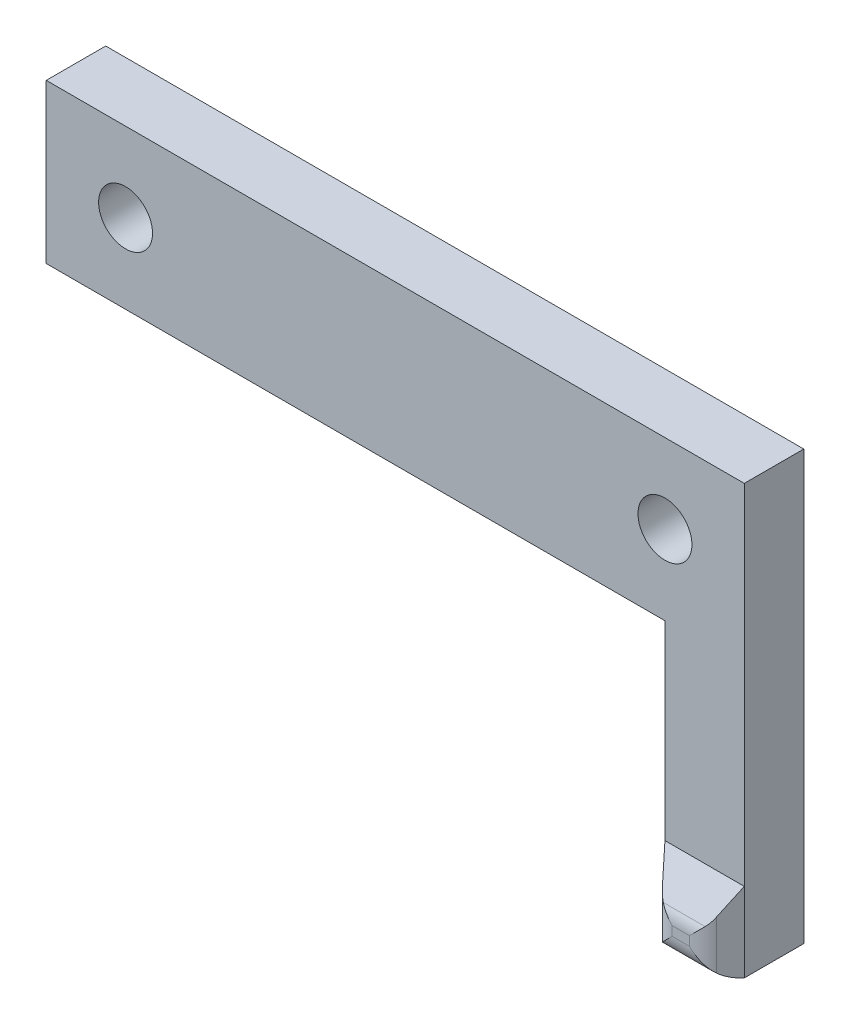
ISO-10303-21;
HEADER;
FILE_DESCRIPTION(('STEP AP214'),'2;1');
FILE_NAME('part.step','',(''),(''),'','','');
FILE_SCHEMA(('AUTOMOTIVE_DESIGN { 1 0 10303 214 1 1 1 1 }'));
ENDSEC;
DATA;
#1=APPLICATION_CONTEXT('core data for automotive mechanical design processes');
#2=APPLICATION_PROTOCOL_DEFINITION('international standard','automotive_design',2000,#1);
#3=PRODUCT_CONTEXT('',#1,'mechanical');
#4=PRODUCT('Part','Part','',(#3));
#5=PRODUCT_RELATED_PRODUCT_CATEGORY('part','',(#4));
#6=PRODUCT_DEFINITION_FORMATION('','',#4);
#7=PRODUCT_DEFINITION_CONTEXT('part definition',#1,'design');
#8=PRODUCT_DEFINITION('design','',#6,#7);
#9=PRODUCT_DEFINITION_SHAPE('','',#8);
#10=(LENGTH_UNIT() NAMED_UNIT(*) SI_UNIT(.MILLI.,.METRE.));
#11=(NAMED_UNIT(*) PLANE_ANGLE_UNIT() SI_UNIT($,.RADIAN.));
#12=(NAMED_UNIT(*) SI_UNIT($,.STERADIAN.) SOLID_ANGLE_UNIT());
#13=UNCERTAINTY_MEASURE_WITH_UNIT(LENGTH_MEASURE(1.E-05),#10,'distance_accuracy_value','');
#14=(GEOMETRIC_REPRESENTATION_CONTEXT(3) GLOBAL_UNCERTAINTY_ASSIGNED_CONTEXT((#13)) GLOBAL_UNIT_ASSIGNED_CONTEXT((#10,
#11,#12)) REPRESENTATION_CONTEXT('',''));
#15=CARTESIAN_POINT('',(0.,0.,0.));
#16=DIRECTION('',(0.,0.,1.));
#17=DIRECTION('',(1.,0.,0.));
#18=AXIS2_PLACEMENT_3D('',#15,#16,#17);
#19=CARTESIAN_POINT('',(78.,-10.,7.5));
#20=DIRECTION('',(0.,1.,0.));
#21=DIRECTION('',(0.,0.,1.));
#22=AXIS2_PLACEMENT_3D('',#19,#20,#21);
#23=PLANE('',#22);
#24=DIRECTION('',(0.,0.,-1.));
#25=VECTOR('',#24,1.);
#26=CARTESIAN_POINT('',(68.,-10.,7.5));
#27=LINE('',#26,#25);
#28=CARTESIAN_POINT('',(68.,-10.,7.5));
#29=VERTEX_POINT('',#28);
#30=CARTESIAN_POINT('',(68.,-10.,0.));
#31=VERTEX_POINT('',#30);
#32=EDGE_CURVE('E273',#29,#31,#27,.T.);
#33=ORIENTED_EDGE('',*,*,#32,.F.);
#34=DIRECTION('',(1.,0.,0.));
#35=VECTOR('',#34,1.);
#36=CARTESIAN_POINT('',(78.,-10.,7.5));
#37=LINE('',#36,#35);
#38=CARTESIAN_POINT('',(-10.,-10.,7.5));
#39=VERTEX_POINT('',#38);
#40=EDGE_CURVE('E174',#39,#29,#37,.T.);
#41=ORIENTED_EDGE('',*,*,#40,.F.);
#42=DIRECTION('',(0.,0.,-1.));
#43=VECTOR('',#42,1.);
#44=CARTESIAN_POINT('',(-10.,-10.,7.5));
#45=LINE('',#44,#43);
#46=CARTESIAN_POINT('',(-10.,-10.,0.));
#47=VERTEX_POINT('',#46);
#48=EDGE_CURVE('E208',#39,#47,#45,.T.);
#49=ORIENTED_EDGE('',*,*,#48,.T.);
#50=DIRECTION('',(1.,0.,0.));
#51=VECTOR('',#50,1.);
#52=CARTESIAN_POINT('',(78.,-10.,0.));
#53=LINE('',#52,#51);
#54=EDGE_CURVE('E300',#47,#31,#53,.T.);
#55=ORIENTED_EDGE('',*,*,#54,.T.);
#56=EDGE_LOOP('',(#33,#41,#49,#55));
#57=FACE_BOUND('',#56,.T.);
#58=ADVANCED_FACE('F57',(#57),#23,.F.);
#59=CARTESIAN_POINT('',(0.,0.,7.5));
#60=DIRECTION('',(0.,0.,-1.));
#61=DIRECTION('',(-1.,0.,0.));
#62=AXIS2_PLACEMENT_3D('',#59,#60,#61);
#63=PLANE('',#62);
#64=DIRECTION('',(0.,1.,0.));
#65=VECTOR('',#64,1.);
#66=CARTESIAN_POINT('',(68.,-44.,7.5));
#67=LINE('',#66,#65);
#68=CARTESIAN_POINT('',(68.,-34.,7.5));
#69=VERTEX_POINT('',#68);
#70=EDGE_CURVE('E170',#69,#29,#67,.T.);
#71=ORIENTED_EDGE('',*,*,#70,.F.);
#72=DIRECTION('',(-1.,0.,0.));
#73=VECTOR('',#72,1.);
#74=CARTESIAN_POINT('',(78.,-34.,7.5));
#75=LINE('',#74,#73);
#76=CARTESIAN_POINT('',(78.,-34.,7.5));
#77=VERTEX_POINT('',#76);
#78=EDGE_CURVE('E149',#77,#69,#75,.T.);
#79=ORIENTED_EDGE('',*,*,#78,.F.);
#80=DIRECTION('',(0.,1.,0.));
#81=VECTOR('',#80,1.);
#82=CARTESIAN_POINT('',(78.,10.,7.5));
#83=LINE('',#82,#81);
#84=CARTESIAN_POINT('',(78.,10.,7.5));
#85=VERTEX_POINT('',#84);
#86=EDGE_CURVE('E203',#77,#85,#83,.T.);
#87=ORIENTED_EDGE('',*,*,#86,.T.);
#88=DIRECTION('',(-1.,0.,0.));
#89=VECTOR('',#88,1.);
#90=CARTESIAN_POINT('',(78.,10.,7.5));
#91=LINE('',#90,#89);
#92=CARTESIAN_POINT('',(-10.,10.,7.5));
#93=VERTEX_POINT('',#92);
#94=EDGE_CURVE('E202',#85,#93,#91,.T.);
#95=ORIENTED_EDGE('',*,*,#94,.T.);
#96=DIRECTION('',(0.,-1.,0.));
#97=VECTOR('',#96,1.);
#98=CARTESIAN_POINT('',(-10.,10.,7.5));
#99=LINE('',#98,#97);
#100=EDGE_CURVE('E296',#93,#39,#99,.T.);
#101=ORIENTED_EDGE('',*,*,#100,.T.);
#102=ORIENTED_EDGE('',*,*,#40,.T.);
#103=EDGE_LOOP('',(#71,#79,#87,#95,#101,#102));
#104=FACE_BOUND('',#103,.T.);
#105=CARTESIAN_POINT('',(0.,0.,7.5));
#106=DIRECTION('',(0.,0.,1.));
#107=DIRECTION('',(1.,0.,0.));
#108=AXIS2_PLACEMENT_3D('',#105,#106,#107);
#109=CIRCLE('',#108,3.4);
#110=CARTESIAN_POINT('',(3.4,0.,7.5));
#111=VERTEX_POINT('',#110);
#112=EDGE_CURVE('E307',#111,#111,#109,.T.);
#113=ORIENTED_EDGE('',*,*,#112,.F.);
#114=EDGE_LOOP('',(#113));
#115=FACE_BOUND('',#114,.T.);
#116=CARTESIAN_POINT('',(68.,0.,7.5));
#117=DIRECTION('',(0.,0.,1.));
#118=DIRECTION('',(1.,0.,0.));
#119=AXIS2_PLACEMENT_3D('',#116,#117,#118);
#120=CIRCLE('',#119,3.4);
#121=CARTESIAN_POINT('',(71.4,0.,7.5));
#122=VERTEX_POINT('',#121);
#123=EDGE_CURVE('E320',#122,#122,#120,.T.);
#124=ORIENTED_EDGE('',*,*,#123,.F.);
#125=EDGE_LOOP('',(#124));
#126=FACE_BOUND('',#125,.T.);
#127=ADVANCED_FACE('F171',(#104,#115,#126),#63,.F.);
#128=CARTESIAN_POINT('',(0.,0.,0.));
#129=DIRECTION('',(0.,0.,-1.));
#130=DIRECTION('',(-1.,0.,0.));
#131=AXIS2_PLACEMENT_3D('',#128,#129,#130);
#132=PLANE('',#131);
#133=CARTESIAN_POINT('',(0.,0.,0.));
#134=DIRECTION('',(0.,0.,1.));
#135=DIRECTION('',(1.,0.,0.));
#136=AXIS2_PLACEMENT_3D('',#133,#134,#135);
#137=CIRCLE('',#136,3.4);
#138=CARTESIAN_POINT('',(3.4,0.,0.));
#139=VERTEX_POINT('',#138);
#140=EDGE_CURVE('E316',#139,#139,#137,.T.);
#141=ORIENTED_EDGE('',*,*,#140,.T.);
#142=EDGE_LOOP('',(#141));
#143=FACE_BOUND('',#142,.T.);
#144=DIRECTION('',(0.,-1.,0.));
#145=VECTOR('',#144,1.);
#146=CARTESIAN_POINT('',(-10.,10.,0.));
#147=LINE('',#146,#145);
#148=CARTESIAN_POINT('',(-10.,10.,0.));
#149=VERTEX_POINT('',#148);
#150=EDGE_CURVE('E303',#149,#47,#147,.T.);
#151=ORIENTED_EDGE('',*,*,#150,.F.);
#152=DIRECTION('',(-1.,0.,0.));
#153=VECTOR('',#152,1.);
#154=CARTESIAN_POINT('',(78.,10.,0.));
#155=LINE('',#154,#153);
#156=CARTESIAN_POINT('',(78.,10.,0.));
#157=VERTEX_POINT('',#156);
#158=EDGE_CURVE('E293',#157,#149,#155,.T.);
#159=ORIENTED_EDGE('',*,*,#158,.F.);
#160=DIRECTION('',(0.,1.,0.));
#161=VECTOR('',#160,1.);
#162=CARTESIAN_POINT('',(78.,10.,0.));
#163=LINE('',#162,#161);
#164=CARTESIAN_POINT('',(78.,-44.,0.));
#165=VERTEX_POINT('',#164);
#166=EDGE_CURVE('E297',#165,#157,#163,.T.);
#167=ORIENTED_EDGE('',*,*,#166,.F.);
#168=DIRECTION('',(1.,0.,0.));
#169=VECTOR('',#168,1.);
#170=CARTESIAN_POINT('',(68.,-44.,0.));
#171=LINE('',#170,#169);
#172=CARTESIAN_POINT('',(68.,-44.,0.));
#173=VERTEX_POINT('',#172);
#174=EDGE_CURVE('E268',#173,#165,#171,.T.);
#175=ORIENTED_EDGE('',*,*,#174,.F.);
#176=DIRECTION('',(0.,1.,0.));
#177=VECTOR('',#176,1.);
#178=CARTESIAN_POINT('',(68.,-44.,0.));
#179=LINE('',#178,#177);
#180=EDGE_CURVE('E186',#173,#31,#179,.T.);
#181=ORIENTED_EDGE('',*,*,#180,.T.);
#182=ORIENTED_EDGE('',*,*,#54,.F.);
#183=EDGE_LOOP('',(#151,#159,#167,#175,#181,#182));
#184=FACE_BOUND('',#183,.T.);
#185=CARTESIAN_POINT('',(68.,0.,0.));
#186=DIRECTION('',(0.,0.,1.));
#187=DIRECTION('',(1.,0.,0.));
#188=AXIS2_PLACEMENT_3D('',#185,#186,#187);
#189=CIRCLE('',#188,3.4);
#190=CARTESIAN_POINT('',(71.4,0.,0.));
#191=VERTEX_POINT('',#190);
#192=EDGE_CURVE('E190',#191,#191,#189,.T.);
#193=ORIENTED_EDGE('',*,*,#192,.T.);
#194=EDGE_LOOP('',(#193));
#195=FACE_BOUND('',#194,.T.);
#196=ADVANCED_FACE('F334',(#143,#184,#195),#132,.T.);
#197=CARTESIAN_POINT('',(-10.,10.,7.5));
#198=DIRECTION('',(1.,0.,0.));
#199=DIRECTION('',(0.,0.,-1.));
#200=AXIS2_PLACEMENT_3D('',#197,#198,#199);
#201=PLANE('',#200);
#202=ORIENTED_EDGE('',*,*,#150,.T.);
#203=ORIENTED_EDGE('',*,*,#48,.F.);
#204=ORIENTED_EDGE('',*,*,#100,.F.);
#205=DIRECTION('',(0.,0.,-1.));
#206=VECTOR('',#205,1.);
#207=CARTESIAN_POINT('',(-10.,10.,7.5));
#208=LINE('',#207,#206);
#209=EDGE_CURVE('E289',#93,#149,#208,.T.);
#210=ORIENTED_EDGE('',*,*,#209,.T.);
#211=EDGE_LOOP('',(#202,#203,#204,#210));
#212=FACE_BOUND('',#211,.T.);
#213=ADVANCED_FACE('F340',(#212),#201,.F.);
#214=CARTESIAN_POINT('',(78.,10.,7.5));
#215=DIRECTION('',(-1.,0.,0.));
#216=DIRECTION('',(0.,0.,1.));
#217=AXIS2_PLACEMENT_3D('',#214,#215,#216);
#218=PLANE('',#217);
#219=ORIENTED_EDGE('',*,*,#166,.T.);
#220=DIRECTION('',(0.,0.,-1.));
#221=VECTOR('',#220,1.);
#222=CARTESIAN_POINT('',(78.,10.,7.5));
#223=LINE('',#222,#221);
#224=EDGE_CURVE('E285',#85,#157,#223,.T.);
#225=ORIENTED_EDGE('',*,*,#224,.F.);
#226=ORIENTED_EDGE('',*,*,#86,.F.);
#227=DIRECTION('',(0.,1.,0.));
#228=VECTOR('',#227,1.);
#229=CARTESIAN_POINT('',(78.,0.,7.5));
#230=LINE('',#229,#228);
#231=CARTESIAN_POINT('',(78.,-44.,7.5));
#232=VERTEX_POINT('',#231);
#233=EDGE_CURVE('E199',#232,#77,#230,.T.);
#234=ORIENTED_EDGE('',*,*,#233,.F.);
#235=DIRECTION('',(0.,0.,1.));
#236=VECTOR('',#235,1.);
#237=CARTESIAN_POINT('',(78.,-44.,0.));
#238=LINE('',#237,#236);
#239=EDGE_CURVE('E179',#165,#232,#238,.T.);
#240=ORIENTED_EDGE('',*,*,#239,.F.);
#241=EDGE_LOOP('',(#219,#225,#226,#234,#240));
#242=FACE_BOUND('',#241,.T.);
#243=ADVANCED_FACE('F263',(#242),#218,.F.);
#244=CARTESIAN_POINT('',(78.,10.,7.5));
#245=DIRECTION('',(0.,-1.,0.));
#246=DIRECTION('',(0.,0.,-1.));
#247=AXIS2_PLACEMENT_3D('',#244,#245,#246);
#248=PLANE('',#247);
#249=ORIENTED_EDGE('',*,*,#158,.T.);
#250=ORIENTED_EDGE('',*,*,#209,.F.);
#251=ORIENTED_EDGE('',*,*,#94,.F.);
#252=ORIENTED_EDGE('',*,*,#224,.T.);
#253=EDGE_LOOP('',(#249,#250,#251,#252));
#254=FACE_BOUND('',#253,.T.);
#255=ADVANCED_FACE('F350',(#254),#248,.F.);
#256=CARTESIAN_POINT('',(0.,0.,7.5));
#257=DIRECTION('',(0.,0.,-1.));
#258=DIRECTION('',(-1.,0.,0.));
#259=AXIS2_PLACEMENT_3D('',#256,#257,#258);
#260=CYLINDRICAL_SURFACE('',#259,3.4);
#261=ORIENTED_EDGE('',*,*,#112,.T.);
#262=EDGE_LOOP('',(#261));
#263=FACE_BOUND('',#262,.T.);
#264=ORIENTED_EDGE('',*,*,#140,.F.);
#265=EDGE_LOOP('',(#264));
#266=FACE_BOUND('',#265,.T.);
#267=ADVANCED_FACE('F347',(#263,#266),#260,.F.);
#268=CARTESIAN_POINT('',(68.,0.,7.5));
#269=DIRECTION('',(0.,0.,-1.));
#270=DIRECTION('',(-1.,0.,0.));
#271=AXIS2_PLACEMENT_3D('',#268,#269,#270);
#272=CYLINDRICAL_SURFACE('',#271,3.4);
#273=ORIENTED_EDGE('',*,*,#123,.T.);
#274=EDGE_LOOP('',(#273));
#275=FACE_BOUND('',#274,.T.);
#276=ORIENTED_EDGE('',*,*,#192,.F.);
#277=EDGE_LOOP('',(#276));
#278=FACE_BOUND('',#277,.T.);
#279=ADVANCED_FACE('F330',(#275,#278),#272,.F.);
#280=CARTESIAN_POINT('',(68.,-44.,7.5));
#281=DIRECTION('',(1.,0.,0.));
#282=DIRECTION('',(0.,0.,-1.));
#283=AXIS2_PLACEMENT_3D('',#280,#281,#282);
#284=PLANE('',#283);
#285=ORIENTED_EDGE('',*,*,#32,.T.);
#286=ORIENTED_EDGE('',*,*,#180,.F.);
#287=DIRECTION('',(0.,0.,-1.));
#288=VECTOR('',#287,1.);
#289=CARTESIAN_POINT('',(68.,-44.,7.5));
#290=LINE('',#289,#288);
#291=CARTESIAN_POINT('',(68.,-44.,7.5));
#292=VERTEX_POINT('',#291);
#293=EDGE_CURVE('E184',#292,#173,#290,.T.);
#294=ORIENTED_EDGE('',*,*,#293,.F.);
#295=DIRECTION('',(0.,1.,0.));
#296=VECTOR('',#295,1.);
#297=CARTESIAN_POINT('',(68.,-44.,7.5));
#298=LINE('',#297,#296);
#299=EDGE_CURVE('E164',#292,#69,#298,.T.);
#300=ORIENTED_EDGE('',*,*,#299,.T.);
#301=ORIENTED_EDGE('',*,*,#70,.T.);
#302=EDGE_LOOP('',(#285,#286,#294,#300,#301));
#303=FACE_BOUND('',#302,.T.);
#304=ADVANCED_FACE('F181',(#303),#284,.F.);
#305=CARTESIAN_POINT('',(0.,-44.,0.));
#306=DIRECTION('',(0.,-1.,0.));
#307=DIRECTION('',(0.,0.,-1.));
#308=AXIS2_PLACEMENT_3D('',#305,#306,#307);
#309=PLANE('',#308);
#310=ORIENTED_EDGE('',*,*,#239,.T.);
#311=DIRECTION('',(1.,0.,0.));
#312=VECTOR('',#311,1.);
#313=CARTESIAN_POINT('',(70.5,-44.,7.5));
#314=LINE('',#313,#312);
#315=EDGE_CURVE('E232',#232,#292,#314,.F.);
#316=ORIENTED_EDGE('',*,*,#315,.T.);
#317=ORIENTED_EDGE('',*,*,#293,.T.);
#318=ORIENTED_EDGE('',*,*,#174,.T.);
#319=EDGE_LOOP('',(#310,#316,#317,#318));
#320=FACE_BOUND('',#319,.T.);
#321=ADVANCED_FACE('F267',(#320),#309,.T.);
#322=CARTESIAN_POINT('',(0.,0.,10.5));
#323=DIRECTION('',(0.,0.,-1.));
#324=DIRECTION('',(-1.,0.,0.));
#325=AXIS2_PLACEMENT_3D('',#322,#323,#324);
#326=PLANE('',#325);
#327=DIRECTION('',(0.,1.,0.));
#328=VECTOR('',#327,1.);
#329=CARTESIAN_POINT('',(74.0948751620467,0.,10.5));
#330=LINE('',#329,#328);
#331=CARTESIAN_POINT('',(74.0948751620467,-41.,10.5));
#332=VERTEX_POINT('',#331);
#333=CARTESIAN_POINT('',(74.0948751620467,-39.8309518948453,10.5));
#334=VERTEX_POINT('',#333);
#335=EDGE_CURVE('E211',#332,#334,#330,.T.);
#336=ORIENTED_EDGE('',*,*,#335,.T.);
#337=DIRECTION('',(-1.,0.,0.));
#338=VECTOR('',#337,1.);
#339=CARTESIAN_POINT('',(0.,-39.8309518948452,10.5));
#340=LINE('',#339,#338);
#341=CARTESIAN_POINT('',(71.9051248379533,-39.8309518948453,10.5));
#342=VERTEX_POINT('',#341);
#343=EDGE_CURVE('E214',#334,#342,#340,.T.);
#344=ORIENTED_EDGE('',*,*,#343,.T.);
#345=DIRECTION('',(0.,-1.,0.));
#346=VECTOR('',#345,1.);
#347=CARTESIAN_POINT('',(71.9051248379533,0.,10.5));
#348=LINE('',#347,#346);
#349=CARTESIAN_POINT('',(71.9051248379533,-41.,10.5));
#350=VERTEX_POINT('',#349);
#351=EDGE_CURVE('E204',#342,#350,#348,.T.);
#352=ORIENTED_EDGE('',*,*,#351,.T.);
#353=DIRECTION('',(1.,0.,0.));
#354=VECTOR('',#353,1.);
#355=CARTESIAN_POINT('',(75.5,-41.,10.5));
#356=LINE('',#355,#354);
#357=EDGE_CURVE('E207',#350,#332,#356,.T.);
#358=ORIENTED_EDGE('',*,*,#357,.T.);
#359=EDGE_LOOP('',(#336,#344,#352,#358));
#360=FACE_BOUND('',#359,.T.);
#361=ADVANCED_FACE('F378',(#360),#326,.F.);
#362=CARTESIAN_POINT('',(36.4426229508198,0.,-30.3688524590164));
#363=DIRECTION('',(0.768221279597377,0.,-0.640184399664478));
#364=DIRECTION('',(-0.640184399664478,0.,-0.768221279597377));
#365=AXIS2_PLACEMENT_3D('',#362,#363,#364);
#366=PLANE('',#365);
#367=ORIENTED_EDGE('',*,*,#299,.F.);
#368=CARTESIAN_POINT('',(68.,-41.,7.5));
#369=DIRECTION('',(0.768221279597377,0.,-0.640184399664478));
#370=DIRECTION('',(-0.640184399664478,0.,-0.768221279597377));
#371=AXIS2_PLACEMENT_3D('',#368,#369,#370);
#372=ELLIPSE('',#371,3.90512483795332,3.);
#373=CARTESIAN_POINT('',(69.6004609991612,-43.3046638387921,9.42055319899343));
#374=VERTEX_POINT('',#373);
#375=EDGE_CURVE('E12',#292,#374,#372,.F.);
#376=ORIENTED_EDGE('',*,*,#375,.T.);
#377=DIRECTION('',(0.,-1.,0.));
#378=VECTOR('',#377,1.);
#379=CARTESIAN_POINT('',(69.6004609991612,0.,9.42055319899343));
#380=LINE('',#379,#378);
#381=CARTESIAN_POINT('',(69.6004609991612,-37.2009219983224,9.42055319899344));
#382=VERTEX_POINT('',#381);
#383=EDGE_CURVE('E67',#374,#382,#380,.F.);
#384=ORIENTED_EDGE('',*,*,#383,.T.);
#385=DIRECTION('',(0.394055203119549,-0.788110406239101,0.472866243743461));
#386=VECTOR('',#385,1.);
#387=CARTESIAN_POINT('',(68.,-34.,7.5));
#388=LINE('',#387,#386);
#389=EDGE_CURVE('E153',#69,#382,#388,.T.);
#390=ORIENTED_EDGE('',*,*,#389,.F.);
#391=EDGE_LOOP('',(#367,#376,#384,#390));
#392=FACE_BOUND('',#391,.T.);
#393=ADVANCED_FACE('F162',(#392),#366,.F.);
#394=CARTESIAN_POINT('',(0.,-5.69117647058822,-9.48529411764703));
#395=DIRECTION('',(0.,-0.514495755427527,-0.857492925712544));
#396=DIRECTION('',(0.,0.857492925712544,-0.514495755427527));
#397=AXIS2_PLACEMENT_3D('',#394,#395,#396);
#398=PLANE('',#397);
#399=DIRECTION('',(-1.,0.,0.));
#400=VECTOR('',#399,1.);
#401=CARTESIAN_POINT('',(0.,-38.2874646285626,10.0724787771376));
#402=LINE('',#401,#400);
#403=CARTESIAN_POINT('',(70.3616375716707,-38.2874646285627,10.0724787771376));
#404=VERTEX_POINT('',#403);
#405=CARTESIAN_POINT('',(75.6383624283293,-38.2874646285627,10.0724787771376));
#406=VERTEX_POINT('',#405);
#407=EDGE_CURVE('E221',#404,#406,#402,.F.);
#408=ORIENTED_EDGE('',*,*,#407,.T.);
#409=CARTESIAN_POINT('',(74.0948751620467,-34.,7.5));
#410=DIRECTION('',(0.,-0.514495755427527,-0.857492925712544));
#411=DIRECTION('',(0.,0.857492925712544,-0.514495755427527));
#412=AXIS2_PLACEMENT_3D('',#409,#410,#411);
#413=ELLIPSE('',#412,5.8309518948453,3.);
#414=CARTESIAN_POINT('',(76.3995390008388,-37.2009219983224,9.42055319899343));
#415=VERTEX_POINT('',#414);
#416=EDGE_CURVE('E224',#406,#415,#413,.F.);
#417=ORIENTED_EDGE('',*,*,#416,.T.);
#418=DIRECTION('',(-0.39405520311955,-0.788110406239101,0.47286624374346));
#419=VECTOR('',#418,1.);
#420=CARTESIAN_POINT('',(78.,-34.,7.5));
#421=LINE('',#420,#419);
#422=EDGE_CURVE('E155',#77,#415,#421,.T.);
#423=ORIENTED_EDGE('',*,*,#422,.F.);
#424=ORIENTED_EDGE('',*,*,#78,.T.);
#425=ORIENTED_EDGE('',*,*,#389,.T.);
#426=CARTESIAN_POINT('',(71.9051248379533,-34.,7.5));
#427=DIRECTION('',(0.,-0.514495755427527,-0.857492925712544));
#428=DIRECTION('',(0.,-0.857492925712544,0.514495755427527));
#429=AXIS2_PLACEMENT_3D('',#426,#427,#428);
#430=ELLIPSE('',#429,5.8309518948453,3.);
#431=EDGE_CURVE('E218',#382,#404,#430,.F.);
#432=ORIENTED_EDGE('',*,*,#431,.T.);
#433=EDGE_LOOP('',(#408,#417,#423,#424,#425,#432));
#434=FACE_BOUND('',#433,.T.);
#435=ADVANCED_FACE('F152',(#434),#398,.F.);
#436=CARTESIAN_POINT('',(49.7213114754098,0.,41.4344262295082));
#437=DIRECTION('',(-0.768221279597376,0.,-0.64018439966448));
#438=DIRECTION('',(-0.64018439966448,0.,0.768221279597376));
#439=AXIS2_PLACEMENT_3D('',#436,#437,#438);
#440=PLANE('',#439);
#441=ORIENTED_EDGE('',*,*,#422,.T.);
#442=DIRECTION('',(0.,1.,0.));
#443=VECTOR('',#442,1.);
#444=CARTESIAN_POINT('',(76.3995390008388,0.,9.42055319899344));
#445=LINE('',#444,#443);
#446=CARTESIAN_POINT('',(76.3995390008388,-43.3046638387921,9.42055319899344));
#447=VERTEX_POINT('',#446);
#448=EDGE_CURVE('E81',#415,#447,#445,.F.);
#449=ORIENTED_EDGE('',*,*,#448,.T.);
#450=CARTESIAN_POINT('',(78.,-41.,7.5));
#451=DIRECTION('',(-0.768221279597376,0.,-0.64018439966448));
#452=DIRECTION('',(-0.64018439966448,0.,0.768221279597376));
#453=AXIS2_PLACEMENT_3D('',#450,#451,#452);
#454=ELLIPSE('',#453,3.90512483795333,3.);
#455=EDGE_CURVE('E227',#447,#232,#454,.F.);
#456=ORIENTED_EDGE('',*,*,#455,.T.);
#457=ORIENTED_EDGE('',*,*,#233,.T.);
#458=EDGE_LOOP('',(#441,#449,#456,#457));
#459=FACE_BOUND('',#458,.T.);
#460=ADVANCED_FACE('F259',(#459),#440,.F.);
#461=CARTESIAN_POINT('',(0.,-41.,7.5));
#462=DIRECTION('',(-1.,0.,0.));
#463=DIRECTION('',(0.,0.,1.));
#464=AXIS2_PLACEMENT_3D('',#461,#462,#463);
#465=CYLINDRICAL_SURFACE('',#464,3.);
#466=ORIENTED_EDGE('',*,*,#315,.F.);
#467=ORIENTED_EDGE('',*,*,#455,.F.);
#468=CARTESIAN_POINT('',(74.0948751620467,-41.,7.5));
#469=DIRECTION('',(-0.707106781186547,-0.707106781186547,0.));
#470=DIRECTION('',(-0.707106781186547,0.707106781186547,0.));
#471=AXIS2_PLACEMENT_3D('',#468,#469,#470);
#472=ELLIPSE('',#471,4.24264068711928,3.);
#473=EDGE_CURVE('E61',#332,#447,#472,.F.);
#474=ORIENTED_EDGE('',*,*,#473,.F.);
#475=ORIENTED_EDGE('',*,*,#357,.F.);
#476=CARTESIAN_POINT('',(71.9051248379533,-41.,7.5));
#477=DIRECTION('',(0.707106781186547,-0.707106781186547,0.));
#478=DIRECTION('',(-0.707106781186547,-0.707106781186547,0.));
#479=AXIS2_PLACEMENT_3D('',#476,#477,#478);
#480=ELLIPSE('',#479,4.24264068711928,3.);
#481=EDGE_CURVE('E242',#374,#350,#480,.F.);
#482=ORIENTED_EDGE('',*,*,#481,.F.);
#483=ORIENTED_EDGE('',*,*,#375,.F.);
#484=EDGE_LOOP('',(#466,#467,#474,#475,#482,#483));
#485=FACE_BOUND('',#484,.T.);
#486=ADVANCED_FACE('F59',(#485),#465,.T.);
#487=CARTESIAN_POINT('',(74.0948751620467,0.,7.5));
#488=DIRECTION('',(0.,1.,0.));
#489=DIRECTION('',(0.,0.,1.));
#490=AXIS2_PLACEMENT_3D('',#487,#488,#489);
#491=CYLINDRICAL_SURFACE('',#490,3.);
#492=ORIENTED_EDGE('',*,*,#448,.F.);
#493=ORIENTED_EDGE('',*,*,#416,.F.);
#494=CARTESIAN_POINT('',(74.0948751620467,-39.8309518948453,7.5));
#495=DIRECTION('',(-0.707106781186547,0.707106781186548,0.));
#496=DIRECTION('',(0.707106781186548,0.707106781186547,0.));
#497=AXIS2_PLACEMENT_3D('',#494,#495,#496);
#498=ELLIPSE('',#497,4.24264068711928,3.);
#499=EDGE_CURVE('E240',#334,#406,#498,.T.);
#500=ORIENTED_EDGE('',*,*,#499,.F.);
#501=ORIENTED_EDGE('',*,*,#335,.F.);
#502=ORIENTED_EDGE('',*,*,#473,.T.);
#503=EDGE_LOOP('',(#492,#493,#500,#501,#502));
#504=FACE_BOUND('',#503,.T.);
#505=ADVANCED_FACE('F252',(#504),#491,.T.);
#506=CARTESIAN_POINT('',(71.9051248379533,0.,7.5));
#507=DIRECTION('',(0.,-1.,0.));
#508=DIRECTION('',(0.,0.,-1.));
#509=AXIS2_PLACEMENT_3D('',#506,#507,#508);
#510=CYLINDRICAL_SURFACE('',#509,3.);
#511=ORIENTED_EDGE('',*,*,#481,.T.);
#512=ORIENTED_EDGE('',*,*,#351,.F.);
#513=CARTESIAN_POINT('',(71.9051248379533,-39.8309518948453,7.5));
#514=DIRECTION('',(-0.707106781186548,-0.707106781186547,0.));
#515=DIRECTION('',(0.707106781186547,-0.707106781186548,0.));
#516=AXIS2_PLACEMENT_3D('',#513,#514,#515);
#517=ELLIPSE('',#516,4.24264068711929,3.);
#518=EDGE_CURVE('E237',#404,#342,#517,.F.);
#519=ORIENTED_EDGE('',*,*,#518,.F.);
#520=ORIENTED_EDGE('',*,*,#431,.F.);
#521=ORIENTED_EDGE('',*,*,#383,.F.);
#522=EDGE_LOOP('',(#511,#512,#519,#520,#521));
#523=FACE_BOUND('',#522,.T.);
#524=ADVANCED_FACE('F361',(#523),#510,.T.);
#525=CARTESIAN_POINT('',(0.,-39.8309518948452,7.5));
#526=DIRECTION('',(-1.,0.,0.));
#527=DIRECTION('',(0.,-1.,0.));
#528=AXIS2_PLACEMENT_3D('',#525,#526,#527);
#529=CYLINDRICAL_SURFACE('',#528,3.);
#530=ORIENTED_EDGE('',*,*,#499,.T.);
#531=ORIENTED_EDGE('',*,*,#407,.F.);
#532=ORIENTED_EDGE('',*,*,#518,.T.);
#533=ORIENTED_EDGE('',*,*,#343,.F.);
#534=EDGE_LOOP('',(#530,#531,#532,#533));
#535=FACE_BOUND('',#534,.T.);
#536=ADVANCED_FACE('F358',(#535),#529,.T.);
#537=CLOSED_SHELL('',(#58,#127,#196,#213,#243,#255,#267,#279,#304,#321,#361,#393,#435,#460,#486,
#505,#524,#536));
#538=MANIFOLD_SOLID_BREP('B2',#537);
#539=ADVANCED_BREP_SHAPE_REPRESENTATION('',(#18,#538),#14);
#540=SHAPE_DEFINITION_REPRESENTATION(#9,#539);
ENDSEC;
END-ISO-10303-21;
